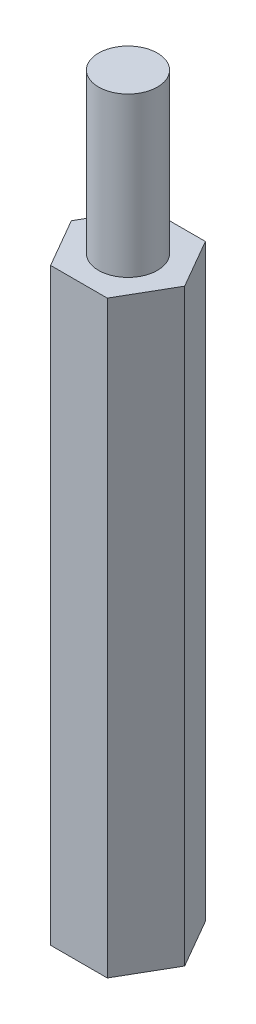
ISO-10303-21;
HEADER;
FILE_DESCRIPTION(('STEP AP214'),'2;1');
FILE_NAME('part.step','',(''),(''),'','','');
FILE_SCHEMA(('AUTOMOTIVE_DESIGN { 1 0 10303 214 1 1 1 1 }'));
ENDSEC;
DATA;
#1=APPLICATION_CONTEXT('core data for automotive mechanical design processes');
#2=APPLICATION_PROTOCOL_DEFINITION('international standard','automotive_design',2000,#1);
#3=PRODUCT_CONTEXT('',#1,'mechanical');
#4=PRODUCT('Part','Part','',(#3));
#5=PRODUCT_RELATED_PRODUCT_CATEGORY('part','',(#4));
#6=PRODUCT_DEFINITION_FORMATION('','',#4);
#7=PRODUCT_DEFINITION_CONTEXT('part definition',#1,'design');
#8=PRODUCT_DEFINITION('design','',#6,#7);
#9=PRODUCT_DEFINITION_SHAPE('','',#8);
#10=(LENGTH_UNIT() NAMED_UNIT(*) SI_UNIT(.MILLI.,.METRE.));
#11=(NAMED_UNIT(*) PLANE_ANGLE_UNIT() SI_UNIT($,.RADIAN.));
#12=(NAMED_UNIT(*) SI_UNIT($,.STERADIAN.) SOLID_ANGLE_UNIT());
#13=UNCERTAINTY_MEASURE_WITH_UNIT(LENGTH_MEASURE(1.E-05),#10,'distance_accuracy_value','');
#14=(GEOMETRIC_REPRESENTATION_CONTEXT(3) GLOBAL_UNCERTAINTY_ASSIGNED_CONTEXT((#13)) GLOBAL_UNIT_ASSIGNED_CONTEXT((#10,
#11,#12)) REPRESENTATION_CONTEXT('',''));
#15=CARTESIAN_POINT('',(0.,0.,0.));
#16=DIRECTION('',(0.,0.,1.));
#17=DIRECTION('',(1.,0.,0.));
#18=AXIS2_PLACEMENT_3D('',#15,#16,#17);
#19=CARTESIAN_POINT('',(-1.44337567297408,30.,-2.49999999999997));
#20=DIRECTION('',(0.866025403784441,0.,0.499999999999995));
#21=DIRECTION('',(0.499999999999995,0.,-0.866025403784442));
#22=AXIS2_PLACEMENT_3D('',#19,#20,#21);
#23=PLANE('',#22);
#24=DIRECTION('',(-0.499999999999995,0.,0.866025403784441));
#25=VECTOR('',#24,1.);
#26=CARTESIAN_POINT('',(-1.44337567297408,0.,-2.49999999999997));
#27=LINE('',#26,#25);
#28=CARTESIAN_POINT('',(-1.44337567297408,0.,-2.49999999999997));
#29=VERTEX_POINT('',#28);
#30=CARTESIAN_POINT('',(-2.88675134594811,0.,0.));
#31=VERTEX_POINT('',#30);
#32=EDGE_CURVE('E134',#29,#31,#27,.T.);
#33=ORIENTED_EDGE('',*,*,#32,.T.);
#34=DIRECTION('',(0.,-1.,0.));
#35=VECTOR('',#34,1.);
#36=CARTESIAN_POINT('',(-2.88675134594811,30.,0.));
#37=LINE('',#36,#35);
#38=CARTESIAN_POINT('',(-2.88675134594811,30.,0.));
#39=VERTEX_POINT('',#38);
#40=EDGE_CURVE('E46',#39,#31,#37,.T.);
#41=ORIENTED_EDGE('',*,*,#40,.F.);
#42=DIRECTION('',(-0.499999999999995,0.,0.866025403784441));
#43=VECTOR('',#42,1.);
#44=CARTESIAN_POINT('',(-1.44337567297408,30.,-2.49999999999997));
#45=LINE('',#44,#43);
#46=CARTESIAN_POINT('',(-1.44337567297408,30.,-2.49999999999997));
#47=VERTEX_POINT('',#46);
#48=EDGE_CURVE('E151',#47,#39,#45,.T.);
#49=ORIENTED_EDGE('',*,*,#48,.F.);
#50=DIRECTION('',(0.,-1.,0.));
#51=VECTOR('',#50,1.);
#52=CARTESIAN_POINT('',(-1.44337567297408,30.,-2.49999999999997));
#53=LINE('',#52,#51);
#54=EDGE_CURVE('E130',#47,#29,#53,.T.);
#55=ORIENTED_EDGE('',*,*,#54,.T.);
#56=EDGE_LOOP('',(#33,#41,#49,#55));
#57=FACE_BOUND('',#56,.T.);
#58=ADVANCED_FACE('F43',(#57),#23,.F.);
#59=CARTESIAN_POINT('',(-2.88675134594811,30.,0.));
#60=DIRECTION('',(0.866025403784438,0.,-0.500000000000001));
#61=DIRECTION('',(-0.500000000000001,0.,-0.866025403784438));
#62=AXIS2_PLACEMENT_3D('',#59,#60,#61);
#63=PLANE('',#62);
#64=DIRECTION('',(0.500000000000001,0.,0.866025403784438));
#65=VECTOR('',#64,1.);
#66=CARTESIAN_POINT('',(-2.88675134594811,0.,0.));
#67=LINE('',#66,#65);
#68=CARTESIAN_POINT('',(-1.44337567297405,0.,2.49999999999999));
#69=VERTEX_POINT('',#68);
#70=EDGE_CURVE('E138',#31,#69,#67,.T.);
#71=ORIENTED_EDGE('',*,*,#70,.T.);
#72=DIRECTION('',(0.,-1.,0.));
#73=VECTOR('',#72,1.);
#74=CARTESIAN_POINT('',(-1.44337567297405,30.,2.49999999999999));
#75=LINE('',#74,#73);
#76=CARTESIAN_POINT('',(-1.44337567297405,30.,2.49999999999999));
#77=VERTEX_POINT('',#76);
#78=EDGE_CURVE('E157',#77,#69,#75,.T.);
#79=ORIENTED_EDGE('',*,*,#78,.F.);
#80=DIRECTION('',(0.500000000000001,0.,0.866025403784438));
#81=VECTOR('',#80,1.);
#82=CARTESIAN_POINT('',(-2.88675134594811,30.,0.));
#83=LINE('',#82,#81);
#84=EDGE_CURVE('E99',#39,#77,#83,.T.);
#85=ORIENTED_EDGE('',*,*,#84,.F.);
#86=ORIENTED_EDGE('',*,*,#40,.T.);
#87=EDGE_LOOP('',(#71,#79,#85,#86));
#88=FACE_BOUND('',#87,.T.);
#89=ADVANCED_FACE('F164',(#88),#63,.F.);
#90=CARTESIAN_POINT('',(-1.44337567297405,30.,2.49999999999999));
#91=DIRECTION('',(0.,0.,-1.));
#92=DIRECTION('',(-1.,0.,0.));
#93=AXIS2_PLACEMENT_3D('',#90,#91,#92);
#94=PLANE('',#93);
#95=DIRECTION('',(1.,0.,0.));
#96=VECTOR('',#95,1.);
#97=CARTESIAN_POINT('',(-1.44337567297405,0.,2.49999999999999));
#98=LINE('',#97,#96);
#99=CARTESIAN_POINT('',(1.44337567297407,0.,2.49999999999998));
#100=VERTEX_POINT('',#99);
#101=EDGE_CURVE('E142',#69,#100,#98,.T.);
#102=ORIENTED_EDGE('',*,*,#101,.T.);
#103=DIRECTION('',(0.,-1.,0.));
#104=VECTOR('',#103,1.);
#105=CARTESIAN_POINT('',(1.44337567297407,30.,2.49999999999998));
#106=LINE('',#105,#104);
#107=CARTESIAN_POINT('',(1.44337567297407,30.,2.49999999999998));
#108=VERTEX_POINT('',#107);
#109=EDGE_CURVE('E123',#108,#100,#106,.T.);
#110=ORIENTED_EDGE('',*,*,#109,.F.);
#111=DIRECTION('',(1.,0.,0.));
#112=VECTOR('',#111,1.);
#113=CARTESIAN_POINT('',(-1.44337567297405,30.,2.49999999999999));
#114=LINE('',#113,#112);
#115=EDGE_CURVE('E112',#77,#108,#114,.T.);
#116=ORIENTED_EDGE('',*,*,#115,.F.);
#117=ORIENTED_EDGE('',*,*,#78,.T.);
#118=EDGE_LOOP('',(#102,#110,#116,#117));
#119=FACE_BOUND('',#118,.T.);
#120=ADVANCED_FACE('F170',(#119),#94,.F.);
#121=CARTESIAN_POINT('',(1.44337567297407,30.,2.49999999999998));
#122=DIRECTION('',(-0.866025403784442,0.,-0.499999999999995));
#123=DIRECTION('',(-0.499999999999995,0.,0.866025403784442));
#124=AXIS2_PLACEMENT_3D('',#121,#122,#123);
#125=PLANE('',#124);
#126=DIRECTION('',(0.499999999999995,0.,-0.866025403784442));
#127=VECTOR('',#126,1.);
#128=CARTESIAN_POINT('',(1.44337567297407,0.,2.49999999999998));
#129=LINE('',#128,#127);
#130=CARTESIAN_POINT('',(2.88675134594811,0.,0.));
#131=VERTEX_POINT('',#130);
#132=EDGE_CURVE('E121',#100,#131,#129,.T.);
#133=ORIENTED_EDGE('',*,*,#132,.T.);
#134=DIRECTION('',(0.,-1.,0.));
#135=VECTOR('',#134,1.);
#136=CARTESIAN_POINT('',(2.88675134594811,30.,0.));
#137=LINE('',#136,#135);
#138=CARTESIAN_POINT('',(2.88675134594811,30.,0.));
#139=VERTEX_POINT('',#138);
#140=EDGE_CURVE('E118',#139,#131,#137,.T.);
#141=ORIENTED_EDGE('',*,*,#140,.F.);
#142=DIRECTION('',(0.499999999999995,0.,-0.866025403784442));
#143=VECTOR('',#142,1.);
#144=CARTESIAN_POINT('',(1.44337567297407,30.,2.49999999999998));
#145=LINE('',#144,#143);
#146=EDGE_CURVE('E106',#108,#139,#145,.T.);
#147=ORIENTED_EDGE('',*,*,#146,.F.);
#148=ORIENTED_EDGE('',*,*,#109,.T.);
#149=EDGE_LOOP('',(#133,#141,#147,#148));
#150=FACE_BOUND('',#149,.T.);
#151=ADVANCED_FACE('F119',(#150),#125,.F.);
#152=CARTESIAN_POINT('',(2.88675134594811,30.,0.));
#153=DIRECTION('',(-0.866025403784435,0.,0.500000000000007));
#154=DIRECTION('',(0.500000000000007,0.,0.866025403784435));
#155=AXIS2_PLACEMENT_3D('',#152,#153,#154);
#156=PLANE('',#155);
#157=DIRECTION('',(-0.500000000000007,0.,-0.866025403784435));
#158=VECTOR('',#157,1.);
#159=CARTESIAN_POINT('',(2.88675134594811,0.,0.));
#160=LINE('',#159,#158);
#161=CARTESIAN_POINT('',(1.44337567297403,0.,-2.5));
#162=VERTEX_POINT('',#161);
#163=EDGE_CURVE('E84',#131,#162,#160,.T.);
#164=ORIENTED_EDGE('',*,*,#163,.T.);
#165=DIRECTION('',(0.,-1.,0.));
#166=VECTOR('',#165,1.);
#167=CARTESIAN_POINT('',(1.44337567297403,30.,-2.5));
#168=LINE('',#167,#166);
#169=CARTESIAN_POINT('',(1.44337567297403,30.,-2.5));
#170=VERTEX_POINT('',#169);
#171=EDGE_CURVE('E124',#170,#162,#168,.T.);
#172=ORIENTED_EDGE('',*,*,#171,.F.);
#173=DIRECTION('',(-0.500000000000007,0.,-0.866025403784435));
#174=VECTOR('',#173,1.);
#175=CARTESIAN_POINT('',(2.88675134594811,30.,0.));
#176=LINE('',#175,#174);
#177=EDGE_CURVE('E110',#139,#170,#176,.T.);
#178=ORIENTED_EDGE('',*,*,#177,.F.);
#179=ORIENTED_EDGE('',*,*,#140,.T.);
#180=EDGE_LOOP('',(#164,#172,#178,#179));
#181=FACE_BOUND('',#180,.T.);
#182=ADVANCED_FACE('F126',(#181),#156,.F.);
#183=CARTESIAN_POINT('',(1.44337567297403,30.,-2.5));
#184=DIRECTION('',(0.,0.,1.));
#185=DIRECTION('',(1.,0.,0.));
#186=AXIS2_PLACEMENT_3D('',#183,#184,#185);
#187=PLANE('',#186);
#188=DIRECTION('',(-1.,0.,0.));
#189=VECTOR('',#188,1.);
#190=CARTESIAN_POINT('',(1.44337567297403,0.,-2.5));
#191=LINE('',#190,#189);
#192=EDGE_CURVE('E90',#162,#29,#191,.T.);
#193=ORIENTED_EDGE('',*,*,#192,.T.);
#194=ORIENTED_EDGE('',*,*,#54,.F.);
#195=DIRECTION('',(-1.,0.,0.));
#196=VECTOR('',#195,1.);
#197=CARTESIAN_POINT('',(1.44337567297403,30.,-2.5));
#198=LINE('',#197,#196);
#199=EDGE_CURVE('E61',#170,#47,#198,.T.);
#200=ORIENTED_EDGE('',*,*,#199,.F.);
#201=ORIENTED_EDGE('',*,*,#171,.T.);
#202=EDGE_LOOP('',(#193,#194,#200,#201));
#203=FACE_BOUND('',#202,.T.);
#204=ADVANCED_FACE('F190',(#203),#187,.F.);
#205=CARTESIAN_POINT('',(0.,30.,0.));
#206=DIRECTION('',(0.,1.,0.));
#207=DIRECTION('',(0.,0.,1.));
#208=AXIS2_PLACEMENT_3D('',#205,#206,#207);
#209=PLANE('',#208);
#210=CARTESIAN_POINT('',(0.,30.,0.));
#211=DIRECTION('',(0.,1.,0.));
#212=DIRECTION('',(0.,0.,1.));
#213=AXIS2_PLACEMENT_3D('',#210,#211,#212);
#214=CIRCLE('',#213,1.5);
#215=CARTESIAN_POINT('',(0.,30.,1.5));
#216=VERTEX_POINT('',#215);
#217=EDGE_CURVE('E11',#216,#216,#214,.T.);
#218=ORIENTED_EDGE('',*,*,#217,.F.);
#219=EDGE_LOOP('',(#218));
#220=FACE_BOUND('',#219,.T.);
#221=ORIENTED_EDGE('',*,*,#48,.T.);
#222=ORIENTED_EDGE('',*,*,#84,.T.);
#223=ORIENTED_EDGE('',*,*,#115,.T.);
#224=ORIENTED_EDGE('',*,*,#146,.T.);
#225=ORIENTED_EDGE('',*,*,#177,.T.);
#226=ORIENTED_EDGE('',*,*,#199,.T.);
#227=EDGE_LOOP('',(#221,#222,#223,#224,#225,#226));
#228=FACE_BOUND('',#227,.T.);
#229=ADVANCED_FACE('F108',(#220,#228),#209,.T.);
#230=CARTESIAN_POINT('',(0.,0.,0.));
#231=DIRECTION('',(0.,1.,0.));
#232=DIRECTION('',(0.,0.,1.));
#233=AXIS2_PLACEMENT_3D('',#230,#231,#232);
#234=PLANE('',#233);
#235=ORIENTED_EDGE('',*,*,#32,.F.);
#236=ORIENTED_EDGE('',*,*,#192,.F.);
#237=ORIENTED_EDGE('',*,*,#163,.F.);
#238=ORIENTED_EDGE('',*,*,#132,.F.);
#239=ORIENTED_EDGE('',*,*,#101,.F.);
#240=ORIENTED_EDGE('',*,*,#70,.F.);
#241=EDGE_LOOP('',(#235,#236,#237,#238,#239,#240));
#242=FACE_BOUND('',#241,.T.);
#243=ADVANCED_FACE('F169',(#242),#234,.F.);
#244=CARTESIAN_POINT('',(0.,38.0916054709663,0.));
#245=DIRECTION('',(0.,-1.,0.));
#246=DIRECTION('',(0.,0.,-1.));
#247=AXIS2_PLACEMENT_3D('',#244,#245,#246);
#248=CYLINDRICAL_SURFACE('',#247,1.5);
#249=CARTESIAN_POINT('',(0.,38.0916054709663,0.));
#250=DIRECTION('',(0.,1.,0.));
#251=DIRECTION('',(0.,0.,1.));
#252=AXIS2_PLACEMENT_3D('',#249,#250,#251);
#253=CIRCLE('',#252,1.5);
#254=CARTESIAN_POINT('',(0.,38.0916054709663,1.5));
#255=VERTEX_POINT('',#254);
#256=EDGE_CURVE('E139',#255,#255,#253,.T.);
#257=ORIENTED_EDGE('',*,*,#256,.F.);
#258=EDGE_LOOP('',(#257));
#259=FACE_BOUND('',#258,.T.);
#260=ORIENTED_EDGE('',*,*,#217,.T.);
#261=EDGE_LOOP('',(#260));
#262=FACE_BOUND('',#261,.T.);
#263=ADVANCED_FACE('F183',(#259,#262),#248,.T.);
#264=CARTESIAN_POINT('',(0.,38.0916054709663,0.));
#265=DIRECTION('',(0.,1.,0.));
#266=DIRECTION('',(0.,0.,1.));
#267=AXIS2_PLACEMENT_3D('',#264,#265,#266);
#268=PLANE('',#267);
#269=ORIENTED_EDGE('',*,*,#256,.T.);
#270=EDGE_LOOP('',(#269));
#271=FACE_BOUND('',#270,.T.);
#272=ADVANCED_FACE('F181',(#271),#268,.T.);
#273=CLOSED_SHELL('',(#58,#89,#120,#151,#182,#204,#229,#243,#263,#272));
#274=MANIFOLD_SOLID_BREP('B2',#273);
#275=ADVANCED_BREP_SHAPE_REPRESENTATION('',(#18,#274),#14);
#276=SHAPE_DEFINITION_REPRESENTATION(#9,#275);
ENDSEC;
END-ISO-10303-21;
